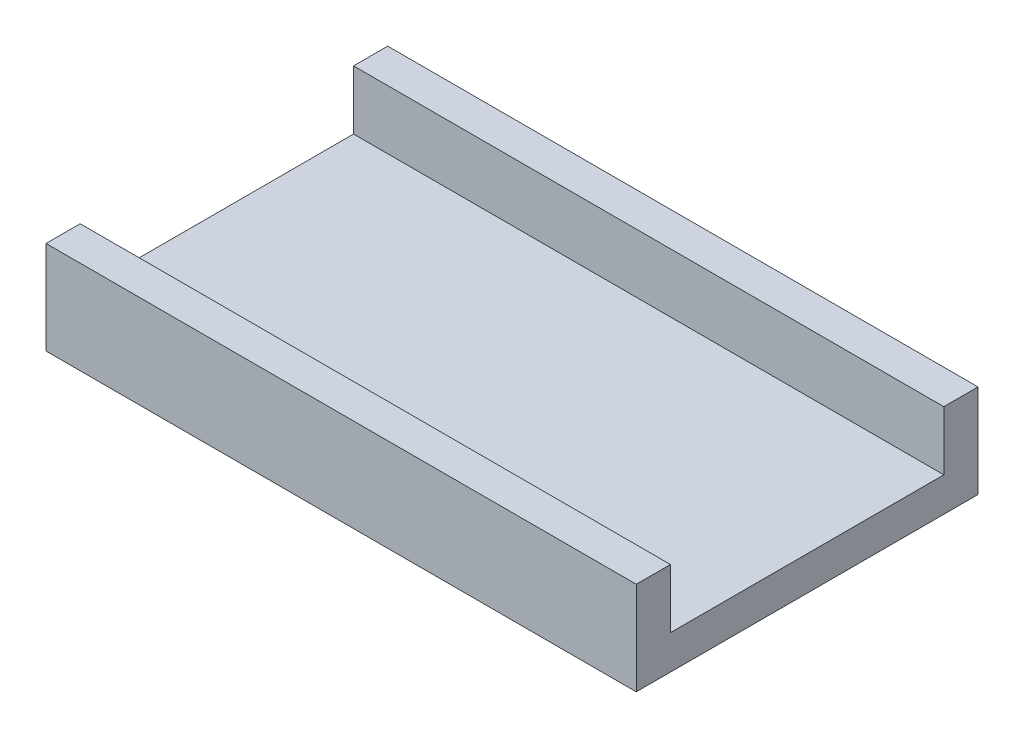
ISO-10303-21;
HEADER;
FILE_DESCRIPTION(('STEP AP214'),'2;1');
FILE_NAME('part.step','',(''),(''),'','','');
FILE_SCHEMA(('AUTOMOTIVE_DESIGN { 1 0 10303 214 1 1 1 1 }'));
ENDSEC;
DATA;
#1=APPLICATION_CONTEXT('core data for automotive mechanical design processes');
#2=APPLICATION_PROTOCOL_DEFINITION('international standard','automotive_design',2000,#1);
#3=PRODUCT_CONTEXT('',#1,'mechanical');
#4=PRODUCT('Part','Part','',(#3));
#5=PRODUCT_RELATED_PRODUCT_CATEGORY('part','',(#4));
#6=PRODUCT_DEFINITION_FORMATION('','',#4);
#7=PRODUCT_DEFINITION_CONTEXT('part definition',#1,'design');
#8=PRODUCT_DEFINITION('design','',#6,#7);
#9=PRODUCT_DEFINITION_SHAPE('','',#8);
#10=(LENGTH_UNIT() NAMED_UNIT(*) SI_UNIT(.MILLI.,.METRE.));
#11=(NAMED_UNIT(*) PLANE_ANGLE_UNIT() SI_UNIT($,.RADIAN.));
#12=(NAMED_UNIT(*) SI_UNIT($,.STERADIAN.) SOLID_ANGLE_UNIT());
#13=UNCERTAINTY_MEASURE_WITH_UNIT(LENGTH_MEASURE(1.E-05),#10,'distance_accuracy_value','');
#14=(GEOMETRIC_REPRESENTATION_CONTEXT(3) GLOBAL_UNCERTAINTY_ASSIGNED_CONTEXT((#13)) GLOBAL_UNIT_ASSIGNED_CONTEXT((#10,
#11,#12)) REPRESENTATION_CONTEXT('',''));
#15=CARTESIAN_POINT('',(0.,0.,0.));
#16=DIRECTION('',(0.,0.,1.));
#17=DIRECTION('',(1.,0.,0.));
#18=AXIS2_PLACEMENT_3D('',#15,#16,#17);
#19=CARTESIAN_POINT('',(32.774999831354,23.150004037422,-0.411480072937));
#20=DIRECTION('',(1.19248806385E-08,0.999999999999996,8.74227765734797E-08));
#21=DIRECTION('',(0.,-8.74227765734797E-08,0.999999999999996));
#22=AXIS2_PLACEMENT_3D('',#19,#20,#21);
#23=PLANE('',#22);
#24=DIRECTION('',(0.,0.,1.));
#25=VECTOR('',#24,1.);
#26=CARTESIAN_POINT('',(33.7249998313547,23.150004030902,-0.411480086051));
#27=LINE('',#26,#25);
#28=CARTESIAN_POINT('',(33.7249998313542,23.1500040337338,-0.466480075013209));
#29=VERTEX_POINT('',#28);
#30=CARTESIAN_POINT('',(33.7249998313542,23.1500040301277,-0.411480072937146));
#31=VERTEX_POINT('',#30);
#32=EDGE_CURVE('E100',#29,#31,#27,.T.);
#33=ORIENTED_EDGE('',*,*,#32,.F.);
#34=DIRECTION('',(1.,0.,0.));
#35=VECTOR('',#34,1.);
#36=CARTESIAN_POINT('',(32.774999830222,23.15000404223,-0.466480072936836));
#37=LINE('',#36,#35);
#38=CARTESIAN_POINT('',(32.7749998310712,23.1500040422301,-0.466480075013209));
#39=VERTEX_POINT('',#38);
#40=EDGE_CURVE('E99',#39,#29,#37,.T.);
#41=ORIENTED_EDGE('',*,*,#40,.F.);
#42=DIRECTION('',(0.,0.,1.));
#43=VECTOR('',#42,1.);
#44=CARTESIAN_POINT('',(32.7749998313547,23.15000404223,-0.411480086051));
#45=LINE('',#44,#43);
#46=CARTESIAN_POINT('',(32.7749998309074,23.150004039826,-0.411480072937146));
#47=VERTEX_POINT('',#46);
#48=EDGE_CURVE('E84',#39,#47,#45,.T.);
#49=ORIENTED_EDGE('',*,*,#48,.T.);
#50=DIRECTION('',(1.,0.,0.));
#51=VECTOR('',#50,1.);
#52=CARTESIAN_POINT('',(32.774999829566,23.150004037422,-0.411480072937584));
#53=LINE('',#52,#51);
#54=EDGE_CURVE('E110',#47,#31,#53,.T.);
#55=ORIENTED_EDGE('',*,*,#54,.T.);
#56=EDGE_LOOP('',(#33,#41,#49,#55));
#57=FACE_BOUND('',#56,.T.);
#58=ADVANCED_FACE('F17',(#57),#23,.T.);
#59=CARTESIAN_POINT('',(32.774999830222,23.055004080696,-0.906480081242));
#60=DIRECTION('',(0.,8.74227765734797E-08,-0.999999999999996));
#61=DIRECTION('',(0.,0.999999999999996,8.74227765734797E-08));
#62=AXIS2_PLACEMENT_3D('',#59,#60,#61);
#63=PLANE('',#62);
#64=DIRECTION('',(1.19248806385E-08,1.,0.));
#65=VECTOR('',#64,1.);
#66=CARTESIAN_POINT('',(32.774999829566,23.000004037422,-0.906480072937));
#67=LINE('',#66,#65);
#68=CARTESIAN_POINT('',(32.7749998310712,23.1500040818984,-0.906480072936959));
#69=VERTEX_POINT('',#68);
#70=CARTESIAN_POINT('',(32.774999830222,23.055004075032,-0.90648007916575));
#71=VERTEX_POINT('',#70);
#72=EDGE_CURVE('E112',#69,#71,#67,.F.);
#73=ORIENTED_EDGE('',*,*,#72,.T.);
#74=DIRECTION('',(1.,-1.19248806384999E-08,0.));
#75=VECTOR('',#74,1.);
#76=CARTESIAN_POINT('',(32.774999830222,23.055004080696,-0.906480081241999));
#77=LINE('',#76,#75);
#78=CARTESIAN_POINT('',(33.724999830788,23.0550040693679,-0.90648007916575));
#79=VERTEX_POINT('',#78);
#80=EDGE_CURVE('E20',#79,#71,#77,.F.);
#81=ORIENTED_EDGE('',*,*,#80,.F.);
#82=DIRECTION('',(1.19248806385E-08,1.,0.));
#83=VECTOR('',#82,1.);
#84=CARTESIAN_POINT('',(33.724999829566,23.000004026093,-0.906480072937));
#85=LINE('',#84,#83);
#86=CARTESIAN_POINT('',(33.7249998313542,23.1500040734018,-0.90648007293696));
#87=VERTEX_POINT('',#86);
#88=EDGE_CURVE('E226',#87,#79,#85,.F.);
#89=ORIENTED_EDGE('',*,*,#88,.F.);
#90=DIRECTION('',(1.,-1.19248806384999E-08,0.));
#91=VECTOR('',#90,1.);
#92=CARTESIAN_POINT('',(32.774999831354,23.1500040806963,-0.906480072937));
#93=LINE('',#92,#91);
#94=EDGE_CURVE('E78',#69,#87,#93,.T.);
#95=ORIENTED_EDGE('',*,*,#94,.F.);
#96=EDGE_LOOP('',(#73,#81,#89,#95));
#97=FACE_BOUND('',#96,.T.);
#98=ADVANCED_FACE('F124',(#97),#63,.F.);
#99=CARTESIAN_POINT('',(32.774999830222,23.05500404223,-0.466480081242));
#100=DIRECTION('',(1.19248806385E-08,0.999999999999996,8.74227765734797E-08));
#101=DIRECTION('',(0.,-8.74227765734797E-08,0.999999999999996));
#102=AXIS2_PLACEMENT_3D('',#99,#100,#101);
#103=PLANE('',#102);
#104=DIRECTION('',(0.,0.,1.));
#105=VECTOR('',#104,1.);
#106=CARTESIAN_POINT('',(33.7249998302219,23.055004069368,-0.411480086051));
#107=LINE('',#106,#105);
#108=CARTESIAN_POINT('',(33.724999830505,23.0550040405182,-0.466480081242001));
#109=VERTEX_POINT('',#108);
#110=EDGE_CURVE('E123',#79,#109,#107,.T.);
#111=ORIENTED_EDGE('',*,*,#110,.F.);
#112=ORIENTED_EDGE('',*,*,#80,.T.);
#113=DIRECTION('',(0.,0.,1.));
#114=VECTOR('',#113,1.);
#115=CARTESIAN_POINT('',(32.7749998302219,23.055004080696,-0.411480086051));
#116=LINE('',#115,#114);
#117=CARTESIAN_POINT('',(32.774999830222,23.0550040490145,-0.466480081242));
#118=VERTEX_POINT('',#117);
#119=EDGE_CURVE('E108',#71,#118,#116,.T.);
#120=ORIENTED_EDGE('',*,*,#119,.T.);
#121=DIRECTION('',(1.,0.,0.));
#122=VECTOR('',#121,1.);
#123=CARTESIAN_POINT('',(32.774999830222,23.055004030902,-0.466480081242001));
#124=LINE('',#123,#122);
#125=EDGE_CURVE('E104',#109,#118,#124,.F.);
#126=ORIENTED_EDGE('',*,*,#125,.F.);
#127=EDGE_LOOP('',(#111,#112,#120,#126));
#128=FACE_BOUND('',#127,.T.);
#129=ADVANCED_FACE('F122',(#128),#103,.T.);
#130=CARTESIAN_POINT('',(32.774999830222,23.05500404223,-0.466480081242));
#131=DIRECTION('',(0.,8.74227765734797E-08,-0.999999999999996));
#132=DIRECTION('',(0.,0.999999999999996,8.74227765734797E-08));
#133=AXIS2_PLACEMENT_3D('',#130,#131,#132);
#134=PLANE('',#133);
#135=DIRECTION('',(1.19248806385E-08,1.,0.));
#136=VECTOR('',#135,1.);
#137=CARTESIAN_POINT('',(32.774999829566,23.000004037422,-0.466480081242));
#138=LINE('',#137,#136);
#139=EDGE_CURVE('E89',#118,#39,#138,.T.);
#140=ORIENTED_EDGE('',*,*,#139,.T.);
#141=ORIENTED_EDGE('',*,*,#40,.T.);
#142=DIRECTION('',(1.19248806385E-08,1.,0.));
#143=VECTOR('',#142,1.);
#144=CARTESIAN_POINT('',(33.724999829566,23.000004026093,-0.466480081242));
#145=LINE('',#144,#143);
#146=EDGE_CURVE('E240',#109,#29,#145,.T.);
#147=ORIENTED_EDGE('',*,*,#146,.F.);
#148=ORIENTED_EDGE('',*,*,#125,.T.);
#149=EDGE_LOOP('',(#140,#141,#147,#148));
#150=FACE_BOUND('',#149,.T.);
#151=ADVANCED_FACE('F106',(#150),#134,.T.);
#152=CARTESIAN_POINT('',(32.774999831354,23.150004037422,-0.411480072937));
#153=DIRECTION('',(1.19248806385E-08,0.999999999999996,8.74227765734797E-08));
#154=DIRECTION('',(0.,-8.74227765734797E-08,0.999999999999996));
#155=AXIS2_PLACEMENT_3D('',#152,#153,#154);
#156=PLANE('',#155);
#157=DIRECTION('',(0.,0.,1.));
#158=VECTOR('',#157,1.);
#159=CARTESIAN_POINT('',(33.7249998313547,23.150004074176,-0.411480086051));
#160=LINE('',#159,#158);
#161=CARTESIAN_POINT('',(33.7249998313542,23.1500040770082,-0.961480076215646));
#162=VERTEX_POINT('',#161);
#163=EDGE_CURVE('E224',#162,#87,#160,.T.);
#164=ORIENTED_EDGE('',*,*,#163,.F.);
#165=DIRECTION('',(1.,0.,0.));
#166=VECTOR('',#165,1.);
#167=CARTESIAN_POINT('',(32.774999829566,23.150004085505,-0.961480072937584));
#168=LINE('',#167,#166);
#169=CARTESIAN_POINT('',(32.7749998309074,23.1500040855049,-0.961480079494146));
#170=VERTEX_POINT('',#169);
#171=EDGE_CURVE('E225',#170,#162,#168,.T.);
#172=ORIENTED_EDGE('',*,*,#171,.F.);
#173=DIRECTION('',(0.,0.,1.));
#174=VECTOR('',#173,1.);
#175=CARTESIAN_POINT('',(32.7749998313547,23.150004085505,-0.411480086051));
#176=LINE('',#175,#174);
#177=EDGE_CURVE('E96',#170,#69,#176,.T.);
#178=ORIENTED_EDGE('',*,*,#177,.T.);
#179=ORIENTED_EDGE('',*,*,#94,.T.);
#180=EDGE_LOOP('',(#164,#172,#178,#179));
#181=FACE_BOUND('',#180,.T.);
#182=ADVANCED_FACE('F153',(#181),#156,.T.);
#183=CARTESIAN_POINT('',(32.774999829566,23.000004037422,-0.411480086051));
#184=DIRECTION('',(1.,-1.19248806385E-08,0.));
#185=DIRECTION('',(1.19248806385E-08,1.,0.));
#186=AXIS2_PLACEMENT_3D('',#183,#184,#185);
#187=PLANE('',#186);
#188=ORIENTED_EDGE('',*,*,#119,.F.);
#189=ORIENTED_EDGE('',*,*,#72,.F.);
#190=ORIENTED_EDGE('',*,*,#177,.F.);
#191=DIRECTION('',(0.,0.999999999999996,8.74227765734797E-08));
#192=VECTOR('',#191,1.);
#193=CARTESIAN_POINT('',(32.774999829566,23.000004085505,-0.961480086051));
#194=LINE('',#193,#192);
#195=CARTESIAN_POINT('',(32.774999829566,23.0000040586311,-0.961480086051));
#196=VERTEX_POINT('',#195);
#197=EDGE_CURVE('E234',#196,#170,#194,.T.);
#198=ORIENTED_EDGE('',*,*,#197,.F.);
#199=DIRECTION('',(0.,-8.74227765734797E-08,0.999999999999996));
#200=VECTOR('',#199,1.);
#201=CARTESIAN_POINT('',(32.774999829566,23.000004037422,-0.411480086051));
#202=LINE('',#201,#200);
#203=CARTESIAN_POINT('',(32.774999829566,23.0000040345898,-0.411480079494));
#204=VERTEX_POINT('',#203);
#205=EDGE_CURVE('E230',#196,#204,#202,.T.);
#206=ORIENTED_EDGE('',*,*,#205,.T.);
#207=DIRECTION('',(0.,0.999999999999996,8.74227765734797E-08));
#208=VECTOR('',#207,1.);
#209=CARTESIAN_POINT('',(32.774999829566,23.000004037422,-0.411480086051));
#210=LINE('',#209,#208);
#211=EDGE_CURVE('E92',#204,#47,#210,.T.);
#212=ORIENTED_EDGE('',*,*,#211,.T.);
#213=ORIENTED_EDGE('',*,*,#48,.F.);
#214=ORIENTED_EDGE('',*,*,#139,.F.);
#215=EDGE_LOOP('',(#188,#189,#190,#198,#206,#212,#213,#214));
#216=FACE_BOUND('',#215,.T.);
#217=ADVANCED_FACE('F87',(#216),#187,.F.);
#218=CARTESIAN_POINT('',(32.774999829566,23.000004037422,-0.411480086051));
#219=DIRECTION('',(0.,8.74227765734797E-08,-0.999999999999996));
#220=DIRECTION('',(0.,0.999999999999996,8.74227765734797E-08));
#221=AXIS2_PLACEMENT_3D('',#218,#219,#220);
#222=PLANE('',#221);
#223=ORIENTED_EDGE('',*,*,#54,.F.);
#224=ORIENTED_EDGE('',*,*,#211,.F.);
#225=DIRECTION('',(1.,-1.19248806384999E-08,0.));
#226=VECTOR('',#225,1.);
#227=CARTESIAN_POINT('',(32.774999829566,23.000004037422,-0.411480086051));
#228=LINE('',#227,#226);
#229=CARTESIAN_POINT('',(33.72499983046,23.0000040260931,-0.411480082772501));
#230=VERTEX_POINT('',#229);
#231=EDGE_CURVE('E232',#204,#230,#228,.T.);
#232=ORIENTED_EDGE('',*,*,#231,.T.);
#233=DIRECTION('',(1.19248806385E-08,1.,0.));
#234=VECTOR('',#233,1.);
#235=CARTESIAN_POINT('',(33.724999829566,23.000004026093,-0.411480072937));
#236=LINE('',#235,#234);
#237=EDGE_CURVE('E227',#31,#230,#236,.F.);
#238=ORIENTED_EDGE('',*,*,#237,.F.);
#239=EDGE_LOOP('',(#223,#224,#232,#238));
#240=FACE_BOUND('',#239,.T.);
#241=ADVANCED_FACE('F146',(#240),#222,.F.);
#242=CARTESIAN_POINT('',(33.724999829566,23.000004026093,-0.411480086051));
#243=DIRECTION('',(1.,-1.19248806385E-08,0.));
#244=DIRECTION('',(1.19248806385E-08,1.,0.));
#245=AXIS2_PLACEMENT_3D('',#242,#243,#244);
#246=PLANE('',#245);
#247=ORIENTED_EDGE('',*,*,#110,.T.);
#248=ORIENTED_EDGE('',*,*,#146,.T.);
#249=ORIENTED_EDGE('',*,*,#32,.T.);
#250=ORIENTED_EDGE('',*,*,#237,.T.);
#251=DIRECTION('',(0.,-8.74227765734797E-08,0.999999999999996));
#252=VECTOR('',#251,1.);
#253=CARTESIAN_POINT('',(33.724999829566,23.0000040260934,-0.411480086051001));
#254=LINE('',#253,#252);
#255=CARTESIAN_POINT('',(33.724999830013,23.0000040501345,-0.961480086051));
#256=VERTEX_POINT('',#255);
#257=EDGE_CURVE('E26',#230,#256,#254,.F.);
#258=ORIENTED_EDGE('',*,*,#257,.T.);
#259=DIRECTION('',(0.,0.999999999999996,8.74227765734797E-08));
#260=VECTOR('',#259,1.);
#261=CARTESIAN_POINT('',(33.724999831354,23.000004085505,-0.961480086051));
#262=LINE('',#261,#260);
#263=EDGE_CURVE('E34',#162,#256,#262,.F.);
#264=ORIENTED_EDGE('',*,*,#263,.F.);
#265=ORIENTED_EDGE('',*,*,#163,.T.);
#266=ORIENTED_EDGE('',*,*,#88,.T.);
#267=EDGE_LOOP('',(#247,#248,#249,#250,#258,#264,#265,#266));
#268=FACE_BOUND('',#267,.T.);
#269=ADVANCED_FACE('F140',(#268),#246,.T.);
#270=CARTESIAN_POINT('',(32.774999829566,23.000004085505,-0.961480086051));
#271=DIRECTION('',(0.,8.74227765734797E-08,-0.999999999999996));
#272=DIRECTION('',(0.,0.999999999999996,8.74227765734797E-08));
#273=AXIS2_PLACEMENT_3D('',#270,#271,#272);
#274=PLANE('',#273);
#275=ORIENTED_EDGE('',*,*,#171,.T.);
#276=ORIENTED_EDGE('',*,*,#263,.T.);
#277=DIRECTION('',(1.,-1.19248806384999E-08,0.));
#278=VECTOR('',#277,1.);
#279=CARTESIAN_POINT('',(32.774999829566,23.0000040855045,-0.961480086050999));
#280=LINE('',#279,#278);
#281=EDGE_CURVE('E11',#256,#196,#280,.F.);
#282=ORIENTED_EDGE('',*,*,#281,.T.);
#283=ORIENTED_EDGE('',*,*,#197,.T.);
#284=EDGE_LOOP('',(#275,#276,#282,#283));
#285=FACE_BOUND('',#284,.T.);
#286=ADVANCED_FACE('F134',(#285),#274,.T.);
#287=CARTESIAN_POINT('',(32.774999829566,23.000004037422,-0.411480086051));
#288=DIRECTION('',(1.19248806385E-08,0.999999999999996,8.74227765734797E-08));
#289=DIRECTION('',(0.,-8.74227765734797E-08,0.999999999999996));
#290=AXIS2_PLACEMENT_3D('',#287,#288,#289);
#291=PLANE('',#290);
#292=ORIENTED_EDGE('',*,*,#257,.F.);
#293=ORIENTED_EDGE('',*,*,#231,.F.);
#294=ORIENTED_EDGE('',*,*,#205,.F.);
#295=ORIENTED_EDGE('',*,*,#281,.F.);
#296=EDGE_LOOP('',(#292,#293,#294,#295));
#297=FACE_BOUND('',#296,.T.);
#298=ADVANCED_FACE('F132',(#297),#291,.F.);
#299=CLOSED_SHELL('',(#58,#98,#129,#151,#182,#217,#241,#269,#286,#298));
#300=MANIFOLD_SOLID_BREP('B1',#299);
#301=ADVANCED_BREP_SHAPE_REPRESENTATION('',(#18,#300),#14);
#302=SHAPE_DEFINITION_REPRESENTATION(#9,#301);
ENDSEC;
END-ISO-10303-21;
